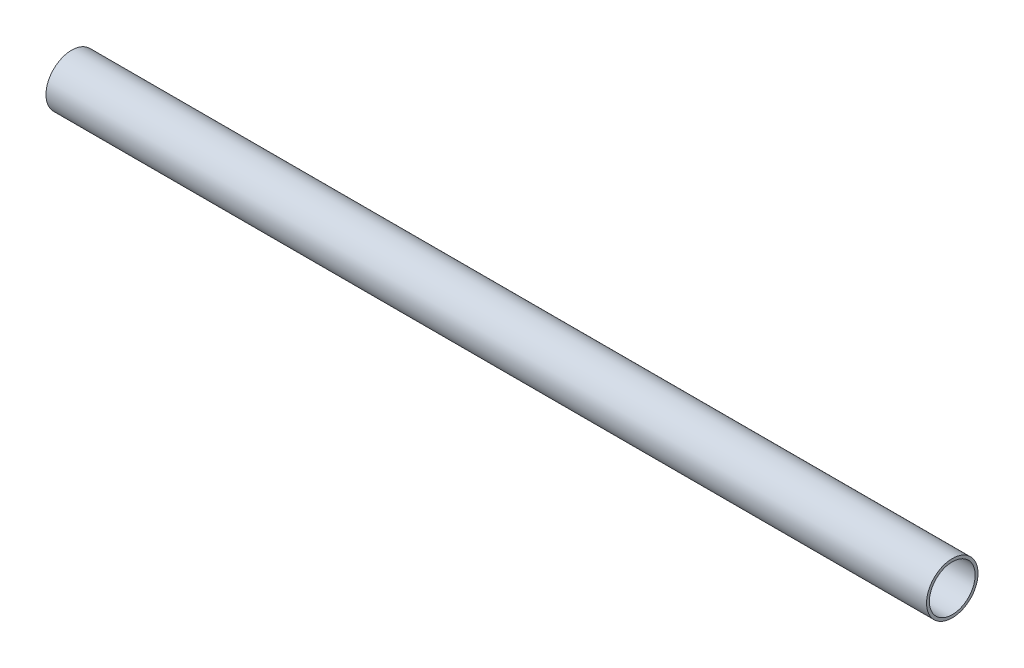
ISO-10303-21;
HEADER;
FILE_DESCRIPTION(('STEP AP214'),'2;1');
FILE_NAME('part.step','',(''),(''),'','','');
FILE_SCHEMA(('AUTOMOTIVE_DESIGN { 1 0 10303 214 1 1 1 1 }'));
ENDSEC;
DATA;
#1=APPLICATION_CONTEXT('core data for automotive mechanical design processes');
#2=APPLICATION_PROTOCOL_DEFINITION('international standard','automotive_design',2000,#1);
#3=PRODUCT_CONTEXT('',#1,'mechanical');
#4=PRODUCT('Part','Part','',(#3));
#5=PRODUCT_RELATED_PRODUCT_CATEGORY('part','',(#4));
#6=PRODUCT_DEFINITION_FORMATION('','',#4);
#7=PRODUCT_DEFINITION_CONTEXT('part definition',#1,'design');
#8=PRODUCT_DEFINITION('design','',#6,#7);
#9=PRODUCT_DEFINITION_SHAPE('','',#8);
#10=(LENGTH_UNIT() NAMED_UNIT(*) SI_UNIT(.MILLI.,.METRE.));
#11=(NAMED_UNIT(*) PLANE_ANGLE_UNIT() SI_UNIT($,.RADIAN.));
#12=(NAMED_UNIT(*) SI_UNIT($,.STERADIAN.) SOLID_ANGLE_UNIT());
#13=UNCERTAINTY_MEASURE_WITH_UNIT(LENGTH_MEASURE(1.E-05),#10,'distance_accuracy_value','');
#14=(GEOMETRIC_REPRESENTATION_CONTEXT(3) GLOBAL_UNCERTAINTY_ASSIGNED_CONTEXT((#13)) GLOBAL_UNIT_ASSIGNED_CONTEXT((#10,
#11,#12)) REPRESENTATION_CONTEXT('',''));
#15=CARTESIAN_POINT('',(0.,0.,0.));
#16=DIRECTION('',(0.,0.,1.));
#17=DIRECTION('',(1.,0.,0.));
#18=AXIS2_PLACEMENT_3D('',#15,#16,#17);
#19=CARTESIAN_POINT('',(0.,0.,0.));
#20=DIRECTION('',(1.,0.,0.));
#21=DIRECTION('',(0.,0.,-1.));
#22=AXIS2_PLACEMENT_3D('',#19,#20,#21);
#23=CYLINDRICAL_SURFACE('',#22,14.2875);
#24=CARTESIAN_POINT('',(0.,0.,0.));
#25=DIRECTION('',(1.,0.,0.));
#26=DIRECTION('',(0.,0.,-1.));
#27=AXIS2_PLACEMENT_3D('',#24,#25,#26);
#28=CIRCLE('',#27,14.2875);
#29=CARTESIAN_POINT('',(0.,0.,-14.2875));
#30=VERTEX_POINT('',#29);
#31=EDGE_CURVE('E10',#30,#30,#28,.T.);
#32=ORIENTED_EDGE('',*,*,#31,.T.);
#33=EDGE_LOOP('',(#32));
#34=FACE_BOUND('',#33,.T.);
#35=CARTESIAN_POINT('',(488.95,0.,0.));
#36=DIRECTION('',(1.,0.,0.));
#37=DIRECTION('',(0.,0.,-1.));
#38=AXIS2_PLACEMENT_3D('',#35,#36,#37);
#39=CIRCLE('',#38,14.2875);
#40=CARTESIAN_POINT('',(488.95,0.,-14.2875));
#41=VERTEX_POINT('',#40);
#42=EDGE_CURVE('E45',#41,#41,#39,.T.);
#43=ORIENTED_EDGE('',*,*,#42,.F.);
#44=EDGE_LOOP('',(#43));
#45=FACE_BOUND('',#44,.T.);
#46=ADVANCED_FACE('F31',(#34,#45),#23,.T.);
#47=CARTESIAN_POINT('',(0.,14.2875,0.));
#48=DIRECTION('',(-1.,0.,0.));
#49=DIRECTION('',(0.,0.,1.));
#50=AXIS2_PLACEMENT_3D('',#47,#48,#49);
#51=PLANE('',#50);
#52=ORIENTED_EDGE('',*,*,#31,.F.);
#53=EDGE_LOOP('',(#52));
#54=FACE_BOUND('',#53,.T.);
#55=ADVANCED_FACE('F55',(#54),#51,.T.);
#56=CARTESIAN_POINT('',(31.75,0.,0.));
#57=DIRECTION('',(1.,0.,0.));
#58=DIRECTION('',(0.,0.,-1.));
#59=AXIS2_PLACEMENT_3D('',#56,#57,#58);
#60=PLANE('',#59);
#61=CARTESIAN_POINT('',(31.75,0.,0.));
#62=DIRECTION('',(1.,0.,0.));
#63=DIRECTION('',(0.,0.,-1.));
#64=AXIS2_PLACEMENT_3D('',#61,#62,#63);
#65=CIRCLE('',#64,12.7);
#66=CARTESIAN_POINT('',(31.75,0.,-12.7));
#67=VERTEX_POINT('',#66);
#68=EDGE_CURVE('E37',#67,#67,#65,.T.);
#69=ORIENTED_EDGE('',*,*,#68,.T.);
#70=EDGE_LOOP('',(#69));
#71=FACE_BOUND('',#70,.T.);
#72=ADVANCED_FACE('F59',(#71),#60,.T.);
#73=CARTESIAN_POINT('',(0.,0.,0.));
#74=DIRECTION('',(1.,0.,0.));
#75=DIRECTION('',(0.,0.,-1.));
#76=AXIS2_PLACEMENT_3D('',#73,#74,#75);
#77=CYLINDRICAL_SURFACE('',#76,12.7);
#78=CARTESIAN_POINT('',(488.95,0.,0.));
#79=DIRECTION('',(1.,0.,0.));
#80=DIRECTION('',(0.,0.,-1.));
#81=AXIS2_PLACEMENT_3D('',#78,#79,#80);
#82=CIRCLE('',#81,12.7);
#83=CARTESIAN_POINT('',(488.95,0.,-12.7));
#84=VERTEX_POINT('',#83);
#85=EDGE_CURVE('E41',#84,#84,#82,.T.);
#86=ORIENTED_EDGE('',*,*,#85,.T.);
#87=EDGE_LOOP('',(#86));
#88=FACE_BOUND('',#87,.T.);
#89=ORIENTED_EDGE('',*,*,#68,.F.);
#90=EDGE_LOOP('',(#89));
#91=FACE_BOUND('',#90,.T.);
#92=ADVANCED_FACE('F64',(#88,#91),#77,.F.);
#93=CARTESIAN_POINT('',(488.95,12.7,0.));
#94=DIRECTION('',(1.,0.,0.));
#95=DIRECTION('',(0.,0.,-1.));
#96=AXIS2_PLACEMENT_3D('',#93,#94,#95);
#97=PLANE('',#96);
#98=ORIENTED_EDGE('',*,*,#42,.T.);
#99=EDGE_LOOP('',(#98));
#100=FACE_BOUND('',#99,.T.);
#101=ORIENTED_EDGE('',*,*,#85,.F.);
#102=EDGE_LOOP('',(#101));
#103=FACE_BOUND('',#102,.T.);
#104=ADVANCED_FACE('F51',(#100,#103),#97,.T.);
#105=CLOSED_SHELL('',(#46,#55,#72,#92,#104));
#106=MANIFOLD_SOLID_BREP('B2',#105);
#107=ADVANCED_BREP_SHAPE_REPRESENTATION('',(#18,#106),#14);
#108=SHAPE_DEFINITION_REPRESENTATION(#9,#107);
ENDSEC;
END-ISO-10303-21;
